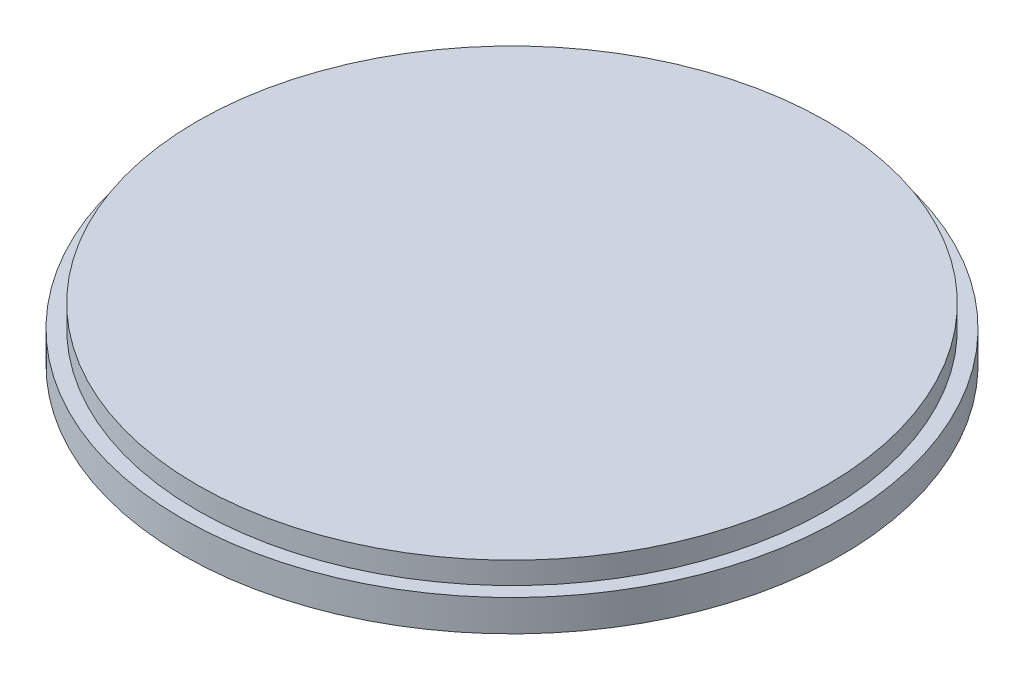
ISO-10303-21;
HEADER;
FILE_DESCRIPTION(('STEP AP214'),'2;1');
FILE_NAME('part.step','',(''),(''),'','','');
FILE_SCHEMA(('AUTOMOTIVE_DESIGN { 1 0 10303 214 1 1 1 1 }'));
ENDSEC;
DATA;
#1=APPLICATION_CONTEXT('core data for automotive mechanical design processes');
#2=APPLICATION_PROTOCOL_DEFINITION('international standard','automotive_design',2000,#1);
#3=PRODUCT_CONTEXT('',#1,'mechanical');
#4=PRODUCT('Part','Part','',(#3));
#5=PRODUCT_RELATED_PRODUCT_CATEGORY('part','',(#4));
#6=PRODUCT_DEFINITION_FORMATION('','',#4);
#7=PRODUCT_DEFINITION_CONTEXT('part definition',#1,'design');
#8=PRODUCT_DEFINITION('design','',#6,#7);
#9=PRODUCT_DEFINITION_SHAPE('','',#8);
#10=(LENGTH_UNIT() NAMED_UNIT(*) SI_UNIT(.MILLI.,.METRE.));
#11=(NAMED_UNIT(*) PLANE_ANGLE_UNIT() SI_UNIT($,.RADIAN.));
#12=(NAMED_UNIT(*) SI_UNIT($,.STERADIAN.) SOLID_ANGLE_UNIT());
#13=UNCERTAINTY_MEASURE_WITH_UNIT(LENGTH_MEASURE(1.E-05),#10,'distance_accuracy_value','');
#14=(GEOMETRIC_REPRESENTATION_CONTEXT(3) GLOBAL_UNCERTAINTY_ASSIGNED_CONTEXT((#13)) GLOBAL_UNIT_ASSIGNED_CONTEXT((#10,
#11,#12)) REPRESENTATION_CONTEXT('',''));
#15=CARTESIAN_POINT('',(0.,0.,0.));
#16=DIRECTION('',(0.,0.,1.));
#17=DIRECTION('',(1.,0.,0.));
#18=AXIS2_PLACEMENT_3D('',#15,#16,#17);
#19=CARTESIAN_POINT('',(-26.5,-7.,0.));
#20=DIRECTION('',(0.,1.,0.));
#21=DIRECTION('',(0.,0.,1.));
#22=AXIS2_PLACEMENT_3D('',#19,#20,#21);
#23=PLANE('',#22);
#24=CARTESIAN_POINT('',(-15.5563491861041,-7.,15.556349186104));
#25=DIRECTION('',(0.,-1.,0.));
#26=DIRECTION('',(0.,0.,-1.));
#27=AXIS2_PLACEMENT_3D('',#24,#25,#26);
#28=CIRCLE('',#27,1.69999999999999);
#29=CARTESIAN_POINT('',(-15.5563491861041,-7.,13.856349186104));
#30=VERTEX_POINT('',#29);
#31=EDGE_CURVE('E66',#30,#30,#28,.T.);
#32=ORIENTED_EDGE('',*,*,#31,.F.);
#33=EDGE_LOOP('',(#32));
#34=FACE_BOUND('',#33,.T.);
#35=CARTESIAN_POINT('',(-15.556349186104,-7.,-15.5563491861041));
#36=DIRECTION('',(0.,-1.,0.));
#37=DIRECTION('',(0.,0.,-1.));
#38=AXIS2_PLACEMENT_3D('',#35,#36,#37);
#39=CIRCLE('',#38,1.69999999999999);
#40=CARTESIAN_POINT('',(-15.556349186104,-7.,-17.2563491861041));
#41=VERTEX_POINT('',#40);
#42=EDGE_CURVE('E65',#41,#41,#39,.T.);
#43=ORIENTED_EDGE('',*,*,#42,.F.);
#44=EDGE_LOOP('',(#43));
#45=FACE_BOUND('',#44,.T.);
#46=CARTESIAN_POINT('',(15.5563491861041,-7.,-15.556349186104));
#47=DIRECTION('',(0.,-1.,0.));
#48=DIRECTION('',(0.,0.,-1.));
#49=AXIS2_PLACEMENT_3D('',#46,#47,#48);
#50=CIRCLE('',#49,1.69999999999999);
#51=CARTESIAN_POINT('',(15.5563491861041,-7.,-17.256349186104));
#52=VERTEX_POINT('',#51);
#53=EDGE_CURVE('E76',#52,#52,#50,.T.);
#54=ORIENTED_EDGE('',*,*,#53,.F.);
#55=EDGE_LOOP('',(#54));
#56=FACE_BOUND('',#55,.T.);
#57=CARTESIAN_POINT('',(15.556349186104,-7.,15.5563491861041));
#58=DIRECTION('',(0.,-1.,0.));
#59=DIRECTION('',(0.,0.,-1.));
#60=AXIS2_PLACEMENT_3D('',#57,#58,#59);
#61=CIRCLE('',#60,1.69999999999999);
#62=CARTESIAN_POINT('',(15.556349186104,-7.,13.8563491861041));
#63=VERTEX_POINT('',#62);
#64=EDGE_CURVE('E82',#63,#63,#61,.T.);
#65=ORIENTED_EDGE('',*,*,#64,.F.);
#66=EDGE_LOOP('',(#65));
#67=FACE_BOUND('',#66,.T.);
#68=CARTESIAN_POINT('',(0.,-7.,0.));
#69=DIRECTION('',(0.,-1.,0.));
#70=DIRECTION('',(0.,0.,-1.));
#71=AXIS2_PLACEMENT_3D('',#68,#69,#70);
#72=CIRCLE('',#71,26.5);
#73=CARTESIAN_POINT('',(0.,-7.,-26.5));
#74=VERTEX_POINT('',#73);
#75=EDGE_CURVE('E90',#74,#74,#72,.T.);
#76=ORIENTED_EDGE('',*,*,#75,.T.);
#77=EDGE_LOOP('',(#76));
#78=FACE_BOUND('',#77,.T.);
#79=ADVANCED_FACE('F34',(#34,#45,#56,#67,#78),#23,.F.);
#80=CARTESIAN_POINT('',(-45.,0.,0.));
#81=DIRECTION('',(0.,-1.,0.));
#82=DIRECTION('',(0.,0.,-1.));
#83=AXIS2_PLACEMENT_3D('',#80,#81,#82);
#84=PLANE('',#83);
#85=CARTESIAN_POINT('',(0.,0.,0.));
#86=DIRECTION('',(0.,1.,0.));
#87=DIRECTION('',(0.,0.,1.));
#88=AXIS2_PLACEMENT_3D('',#85,#86,#87);
#89=CIRCLE('',#88,43.);
#90=CARTESIAN_POINT('',(0.,0.,43.));
#91=VERTEX_POINT('',#90);
#92=EDGE_CURVE('E11',#91,#91,#89,.T.);
#93=ORIENTED_EDGE('',*,*,#92,.F.);
#94=EDGE_LOOP('',(#93));
#95=FACE_BOUND('',#94,.T.);
#96=CARTESIAN_POINT('',(0.,0.,0.));
#97=DIRECTION('',(0.,-1.,0.));
#98=DIRECTION('',(0.,0.,-1.));
#99=AXIS2_PLACEMENT_3D('',#96,#97,#98);
#100=CIRCLE('',#99,45.);
#101=CARTESIAN_POINT('',(0.,0.,-45.));
#102=VERTEX_POINT('',#101);
#103=EDGE_CURVE('E37',#102,#102,#100,.T.);
#104=ORIENTED_EDGE('',*,*,#103,.F.);
#105=EDGE_LOOP('',(#104));
#106=FACE_BOUND('',#105,.T.);
#107=ADVANCED_FACE('F102',(#95,#106),#84,.F.);
#108=CARTESIAN_POINT('',(0.,-7.,0.));
#109=DIRECTION('',(0.,-1.,0.));
#110=DIRECTION('',(0.,0.,-1.));
#111=AXIS2_PLACEMENT_3D('',#108,#109,#110);
#112=CYLINDRICAL_SURFACE('',#111,45.);
#113=CARTESIAN_POINT('',(0.,-4.3,0.));
#114=DIRECTION('',(0.,-1.,0.));
#115=DIRECTION('',(0.,0.,-1.));
#116=AXIS2_PLACEMENT_3D('',#113,#114,#115);
#117=CIRCLE('',#116,45.);
#118=CARTESIAN_POINT('',(0.,-4.3,-45.));
#119=VERTEX_POINT('',#118);
#120=EDGE_CURVE('E93',#119,#119,#117,.T.);
#121=ORIENTED_EDGE('',*,*,#120,.F.);
#122=EDGE_LOOP('',(#121));
#123=FACE_BOUND('',#122,.T.);
#124=ORIENTED_EDGE('',*,*,#103,.T.);
#125=EDGE_LOOP('',(#124));
#126=FACE_BOUND('',#125,.T.);
#127=ADVANCED_FACE('F100',(#123,#126),#112,.T.);
#128=CARTESIAN_POINT('',(0.,-4.3,0.));
#129=DIRECTION('',(0.,1.,0.));
#130=DIRECTION('',(0.,0.,1.));
#131=AXIS2_PLACEMENT_3D('',#128,#129,#130);
#132=CONICAL_SURFACE('',#131,45.,1.42587356281597);
#133=ORIENTED_EDGE('',*,*,#75,.F.);
#134=EDGE_LOOP('',(#133));
#135=FACE_BOUND('',#134,.T.);
#136=ORIENTED_EDGE('',*,*,#120,.T.);
#137=EDGE_LOOP('',(#136));
#138=FACE_BOUND('',#137,.T.);
#139=ADVANCED_FACE('F109',(#135,#138),#132,.T.);
#140=CARTESIAN_POINT('',(0.,3.,0.));
#141=DIRECTION('',(0.,-1.,0.));
#142=DIRECTION('',(0.,0.,-1.));
#143=AXIS2_PLACEMENT_3D('',#140,#141,#142);
#144=CYLINDRICAL_SURFACE('',#143,43.);
#145=CARTESIAN_POINT('',(0.,3.,0.));
#146=DIRECTION('',(0.,1.,0.));
#147=DIRECTION('',(0.,0.,1.));
#148=AXIS2_PLACEMENT_3D('',#145,#146,#147);
#149=CIRCLE('',#148,43.);
#150=CARTESIAN_POINT('',(0.,3.,43.));
#151=VERTEX_POINT('',#150);
#152=EDGE_CURVE('E88',#151,#151,#149,.T.);
#153=ORIENTED_EDGE('',*,*,#152,.F.);
#154=EDGE_LOOP('',(#153));
#155=FACE_BOUND('',#154,.T.);
#156=ORIENTED_EDGE('',*,*,#92,.T.);
#157=EDGE_LOOP('',(#156));
#158=FACE_BOUND('',#157,.T.);
#159=ADVANCED_FACE('F117',(#155,#158),#144,.T.);
#160=CARTESIAN_POINT('',(0.,3.,0.));
#161=DIRECTION('',(0.,1.,0.));
#162=DIRECTION('',(0.,0.,1.));
#163=AXIS2_PLACEMENT_3D('',#160,#161,#162);
#164=PLANE('',#163);
#165=ORIENTED_EDGE('',*,*,#152,.T.);
#166=EDGE_LOOP('',(#165));
#167=FACE_BOUND('',#166,.T.);
#168=ADVANCED_FACE('F121',(#167),#164,.T.);
#169=CARTESIAN_POINT('',(15.556349186104,-3.,15.5563491861041));
#170=DIRECTION('',(0.,-1.,0.));
#171=DIRECTION('',(0.,0.,-1.));
#172=AXIS2_PLACEMENT_3D('',#169,#170,#171);
#173=CONICAL_SURFACE('',#172,1.69999999999999,1.02974425867665);
#174=CARTESIAN_POINT('',(15.556349186104,-1.97853694765315,15.5563491861041));
#175=VERTEX_POINT('',#174);
#176=VERTEX_LOOP('',#175);
#177=FACE_BOUND('',#176,.T.);
#178=CARTESIAN_POINT('',(15.556349186104,-3.,15.5563491861041));
#179=DIRECTION('',(0.,-1.,0.));
#180=DIRECTION('',(0.,0.,-1.));
#181=AXIS2_PLACEMENT_3D('',#178,#179,#180);
#182=CIRCLE('',#181,1.69999999999999);
#183=CARTESIAN_POINT('',(15.556349186104,-3.,13.8563491861041));
#184=VERTEX_POINT('',#183);
#185=EDGE_CURVE('E85',#184,#184,#182,.T.);
#186=ORIENTED_EDGE('',*,*,#185,.T.);
#187=EDGE_LOOP('',(#186));
#188=FACE_BOUND('',#187,.T.);
#189=ADVANCED_FACE('F125',(#177,#188),#173,.F.);
#190=CARTESIAN_POINT('',(15.556349186104,-7.,15.5563491861041));
#191=DIRECTION('',(0.,-1.,0.));
#192=DIRECTION('',(0.,0.,-1.));
#193=AXIS2_PLACEMENT_3D('',#190,#191,#192);
#194=CYLINDRICAL_SURFACE('',#193,1.69999999999999);
#195=ORIENTED_EDGE('',*,*,#185,.F.);
#196=EDGE_LOOP('',(#195));
#197=FACE_BOUND('',#196,.T.);
#198=ORIENTED_EDGE('',*,*,#64,.T.);
#199=EDGE_LOOP('',(#198));
#200=FACE_BOUND('',#199,.T.);
#201=ADVANCED_FACE('F129',(#197,#200),#194,.F.);
#202=CARTESIAN_POINT('',(15.5563491861041,-3.,-15.556349186104));
#203=DIRECTION('',(0.,-1.,0.));
#204=DIRECTION('',(0.,0.,-1.));
#205=AXIS2_PLACEMENT_3D('',#202,#203,#204);
#206=CONICAL_SURFACE('',#205,1.69999999999999,1.02974425867665);
#207=CARTESIAN_POINT('',(15.5563491861041,-1.97853694765315,-15.556349186104));
#208=VERTEX_POINT('',#207);
#209=VERTEX_LOOP('',#208);
#210=FACE_BOUND('',#209,.T.);
#211=CARTESIAN_POINT('',(15.5563491861041,-3.,-15.556349186104));
#212=DIRECTION('',(0.,-1.,0.));
#213=DIRECTION('',(0.,0.,-1.));
#214=AXIS2_PLACEMENT_3D('',#211,#212,#213);
#215=CIRCLE('',#214,1.69999999999999);
#216=CARTESIAN_POINT('',(15.5563491861041,-3.,-17.256349186104));
#217=VERTEX_POINT('',#216);
#218=EDGE_CURVE('E79',#217,#217,#215,.T.);
#219=ORIENTED_EDGE('',*,*,#218,.T.);
#220=EDGE_LOOP('',(#219));
#221=FACE_BOUND('',#220,.T.);
#222=ADVANCED_FACE('F132',(#210,#221),#206,.F.);
#223=CARTESIAN_POINT('',(15.5563491861041,-7.,-15.556349186104));
#224=DIRECTION('',(0.,-1.,0.));
#225=DIRECTION('',(0.,0.,-1.));
#226=AXIS2_PLACEMENT_3D('',#223,#224,#225);
#227=CYLINDRICAL_SURFACE('',#226,1.69999999999999);
#228=ORIENTED_EDGE('',*,*,#218,.F.);
#229=EDGE_LOOP('',(#228));
#230=FACE_BOUND('',#229,.T.);
#231=ORIENTED_EDGE('',*,*,#53,.T.);
#232=EDGE_LOOP('',(#231));
#233=FACE_BOUND('',#232,.T.);
#234=ADVANCED_FACE('F136',(#230,#233),#227,.F.);
#235=CARTESIAN_POINT('',(-15.556349186104,-3.,-15.5563491861041));
#236=DIRECTION('',(0.,-1.,0.));
#237=DIRECTION('',(0.,0.,-1.));
#238=AXIS2_PLACEMENT_3D('',#235,#236,#237);
#239=CONICAL_SURFACE('',#238,1.69999999999999,1.02974425867665);
#240=CARTESIAN_POINT('',(-15.556349186104,-1.97853694765315,-15.5563491861041));
#241=VERTEX_POINT('',#240);
#242=VERTEX_LOOP('',#241);
#243=FACE_BOUND('',#242,.T.);
#244=CARTESIAN_POINT('',(-15.556349186104,-3.,-15.5563491861041));
#245=DIRECTION('',(0.,-1.,0.));
#246=DIRECTION('',(0.,0.,-1.));
#247=AXIS2_PLACEMENT_3D('',#244,#245,#246);
#248=CIRCLE('',#247,1.69999999999999);
#249=CARTESIAN_POINT('',(-15.556349186104,-3.,-17.2563491861041));
#250=VERTEX_POINT('',#249);
#251=EDGE_CURVE('E69',#250,#250,#248,.T.);
#252=ORIENTED_EDGE('',*,*,#251,.T.);
#253=EDGE_LOOP('',(#252));
#254=FACE_BOUND('',#253,.T.);
#255=ADVANCED_FACE('F139',(#243,#254),#239,.F.);
#256=CARTESIAN_POINT('',(-15.556349186104,-7.,-15.5563491861041));
#257=DIRECTION('',(0.,-1.,0.));
#258=DIRECTION('',(0.,0.,-1.));
#259=AXIS2_PLACEMENT_3D('',#256,#257,#258);
#260=CYLINDRICAL_SURFACE('',#259,1.69999999999999);
#261=ORIENTED_EDGE('',*,*,#251,.F.);
#262=EDGE_LOOP('',(#261));
#263=FACE_BOUND('',#262,.T.);
#264=ORIENTED_EDGE('',*,*,#42,.T.);
#265=EDGE_LOOP('',(#264));
#266=FACE_BOUND('',#265,.T.);
#267=ADVANCED_FACE('F59',(#263,#266),#260,.F.);
#268=CARTESIAN_POINT('',(-15.5563491861041,-3.,15.556349186104));
#269=DIRECTION('',(0.,-1.,0.));
#270=DIRECTION('',(0.,0.,-1.));
#271=AXIS2_PLACEMENT_3D('',#268,#269,#270);
#272=CONICAL_SURFACE('',#271,1.69999999999999,1.02974425867665);
#273=CARTESIAN_POINT('',(-15.5563491861041,-1.97853694765315,15.556349186104));
#274=VERTEX_POINT('',#273);
#275=VERTEX_LOOP('',#274);
#276=FACE_BOUND('',#275,.T.);
#277=CARTESIAN_POINT('',(-15.5563491861041,-3.,15.556349186104));
#278=DIRECTION('',(0.,-1.,0.));
#279=DIRECTION('',(0.,0.,-1.));
#280=AXIS2_PLACEMENT_3D('',#277,#278,#279);
#281=CIRCLE('',#280,1.69999999999999);
#282=CARTESIAN_POINT('',(-15.5563491861041,-3.,13.856349186104));
#283=VERTEX_POINT('',#282);
#284=EDGE_CURVE('E63',#283,#283,#281,.T.);
#285=ORIENTED_EDGE('',*,*,#284,.T.);
#286=EDGE_LOOP('',(#285));
#287=FACE_BOUND('',#286,.T.);
#288=ADVANCED_FACE('F55',(#276,#287),#272,.F.);
#289=CARTESIAN_POINT('',(-15.5563491861041,-7.,15.556349186104));
#290=DIRECTION('',(0.,-1.,0.));
#291=DIRECTION('',(0.,0.,-1.));
#292=AXIS2_PLACEMENT_3D('',#289,#290,#291);
#293=CYLINDRICAL_SURFACE('',#292,1.69999999999999);
#294=ORIENTED_EDGE('',*,*,#284,.F.);
#295=EDGE_LOOP('',(#294));
#296=FACE_BOUND('',#295,.T.);
#297=ORIENTED_EDGE('',*,*,#31,.T.);
#298=EDGE_LOOP('',(#297));
#299=FACE_BOUND('',#298,.T.);
#300=ADVANCED_FACE('F58',(#296,#299),#293,.F.);
#301=CLOSED_SHELL('',(#79,#107,#127,#139,#159,#168,#189,#201,#222,#234,#255,#267,#288,#300));
#302=MANIFOLD_SOLID_BREP('B2',#301);
#303=ADVANCED_BREP_SHAPE_REPRESENTATION('',(#18,#302),#14);
#304=SHAPE_DEFINITION_REPRESENTATION(#9,#303);
ENDSEC;
END-ISO-10303-21;
